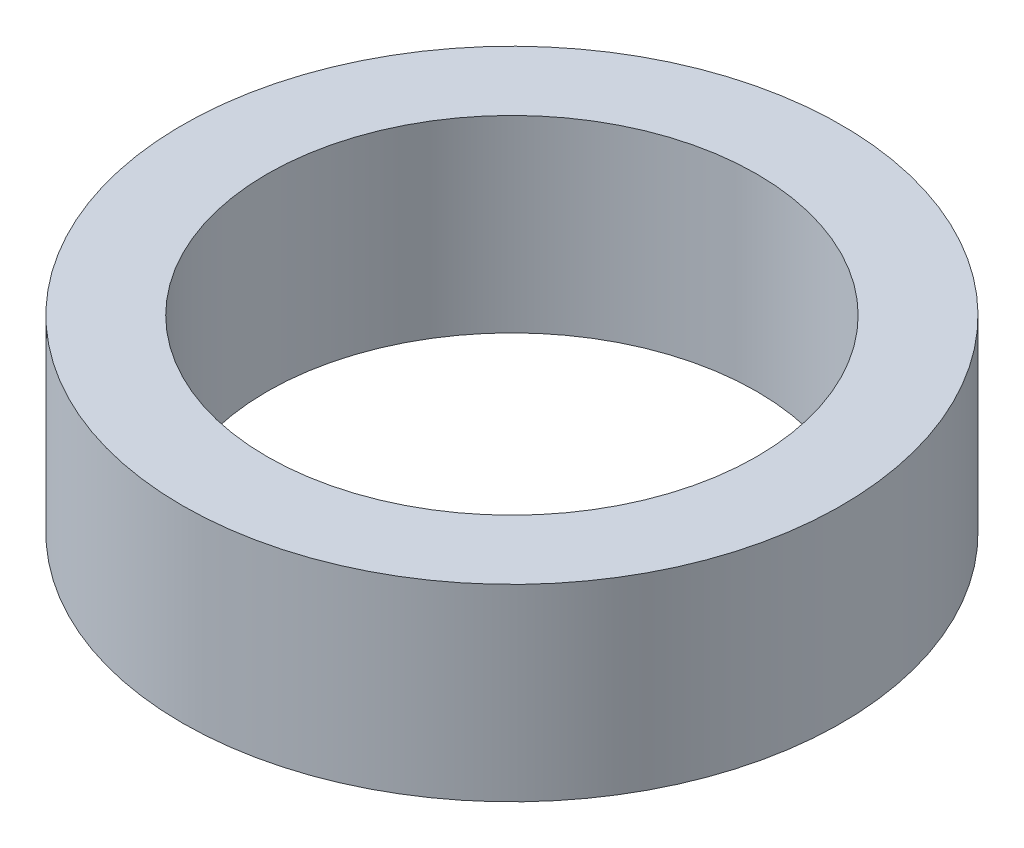
ISO-10303-21;
HEADER;
FILE_DESCRIPTION(('STEP AP214'),'2;1');
FILE_NAME('part.step','',(''),(''),'','','');
FILE_SCHEMA(('AUTOMOTIVE_DESIGN { 1 0 10303 214 1 1 1 1 }'));
ENDSEC;
DATA;
#1=APPLICATION_CONTEXT('core data for automotive mechanical design processes');
#2=APPLICATION_PROTOCOL_DEFINITION('international standard','automotive_design',2000,#1);
#3=PRODUCT_CONTEXT('',#1,'mechanical');
#4=PRODUCT('Part','Part','',(#3));
#5=PRODUCT_RELATED_PRODUCT_CATEGORY('part','',(#4));
#6=PRODUCT_DEFINITION_FORMATION('','',#4);
#7=PRODUCT_DEFINITION_CONTEXT('part definition',#1,'design');
#8=PRODUCT_DEFINITION('design','',#6,#7);
#9=PRODUCT_DEFINITION_SHAPE('','',#8);
#10=(LENGTH_UNIT() NAMED_UNIT(*) SI_UNIT(.MILLI.,.METRE.));
#11=(NAMED_UNIT(*) PLANE_ANGLE_UNIT() SI_UNIT($,.RADIAN.));
#12=(NAMED_UNIT(*) SI_UNIT($,.STERADIAN.) SOLID_ANGLE_UNIT());
#13=UNCERTAINTY_MEASURE_WITH_UNIT(LENGTH_MEASURE(1.E-05),#10,'distance_accuracy_value','');
#14=(GEOMETRIC_REPRESENTATION_CONTEXT(3) GLOBAL_UNCERTAINTY_ASSIGNED_CONTEXT((#13)) GLOBAL_UNIT_ASSIGNED_CONTEXT((#10,
#11,#12)) REPRESENTATION_CONTEXT('',''));
#15=CARTESIAN_POINT('',(0.,0.,0.));
#16=DIRECTION('',(0.,0.,1.));
#17=DIRECTION('',(1.,0.,0.));
#18=AXIS2_PLACEMENT_3D('',#15,#16,#17);
#19=CARTESIAN_POINT('',(0.,2.,0.));
#20=DIRECTION('',(0.,1.,0.));
#21=DIRECTION('',(0.,0.,1.));
#22=AXIS2_PLACEMENT_3D('',#19,#20,#21);
#23=PLANE('',#22);
#24=CARTESIAN_POINT('',(0.,2.,0.));
#25=DIRECTION('',(0.,1.,0.));
#26=DIRECTION('',(0.,0.,1.));
#27=AXIS2_PLACEMENT_3D('',#24,#25,#26);
#28=CIRCLE('',#27,3.5);
#29=CARTESIAN_POINT('',(0.,2.,3.5));
#30=VERTEX_POINT('',#29);
#31=EDGE_CURVE('E10',#30,#30,#28,.T.);
#32=ORIENTED_EDGE('',*,*,#31,.T.);
#33=EDGE_LOOP('',(#32));
#34=FACE_BOUND('',#33,.T.);
#35=CARTESIAN_POINT('',(0.,2.,0.));
#36=DIRECTION('',(0.,1.,0.));
#37=DIRECTION('',(0.,0.,1.));
#38=AXIS2_PLACEMENT_3D('',#35,#36,#37);
#39=CIRCLE('',#38,2.6);
#40=CARTESIAN_POINT('',(0.,2.,2.6));
#41=VERTEX_POINT('',#40);
#42=EDGE_CURVE('E47',#41,#41,#39,.T.);
#43=ORIENTED_EDGE('',*,*,#42,.F.);
#44=EDGE_LOOP('',(#43));
#45=FACE_BOUND('',#44,.T.);
#46=ADVANCED_FACE('F36',(#34,#45),#23,.T.);
#47=CARTESIAN_POINT('',(0.,0.,0.));
#48=DIRECTION('',(0.,1.,0.));
#49=DIRECTION('',(0.,0.,1.));
#50=AXIS2_PLACEMENT_3D('',#47,#48,#49);
#51=PLANE('',#50);
#52=CARTESIAN_POINT('',(0.,0.,0.));
#53=DIRECTION('',(0.,1.,0.));
#54=DIRECTION('',(0.,0.,1.));
#55=AXIS2_PLACEMENT_3D('',#52,#53,#54);
#56=CIRCLE('',#55,3.5);
#57=CARTESIAN_POINT('',(0.,0.,3.5));
#58=VERTEX_POINT('',#57);
#59=EDGE_CURVE('E40',#58,#58,#56,.T.);
#60=ORIENTED_EDGE('',*,*,#59,.F.);
#61=EDGE_LOOP('',(#60));
#62=FACE_BOUND('',#61,.T.);
#63=CARTESIAN_POINT('',(0.,0.,0.));
#64=DIRECTION('',(0.,1.,0.));
#65=DIRECTION('',(0.,0.,1.));
#66=AXIS2_PLACEMENT_3D('',#63,#64,#65);
#67=CIRCLE('',#66,2.6);
#68=CARTESIAN_POINT('',(0.,0.,2.6));
#69=VERTEX_POINT('',#68);
#70=EDGE_CURVE('E49',#69,#69,#67,.T.);
#71=ORIENTED_EDGE('',*,*,#70,.T.);
#72=EDGE_LOOP('',(#71));
#73=FACE_BOUND('',#72,.T.);
#74=ADVANCED_FACE('F59',(#62,#73),#51,.F.);
#75=CARTESIAN_POINT('',(0.,2.,0.));
#76=DIRECTION('',(0.,-1.,0.));
#77=DIRECTION('',(0.,0.,-1.));
#78=AXIS2_PLACEMENT_3D('',#75,#76,#77);
#79=CYLINDRICAL_SURFACE('',#78,3.5);
#80=ORIENTED_EDGE('',*,*,#31,.F.);
#81=EDGE_LOOP('',(#80));
#82=FACE_BOUND('',#81,.T.);
#83=ORIENTED_EDGE('',*,*,#59,.T.);
#84=EDGE_LOOP('',(#83));
#85=FACE_BOUND('',#84,.T.);
#86=ADVANCED_FACE('F38',(#82,#85),#79,.T.);
#87=CARTESIAN_POINT('',(0.,2.,0.));
#88=DIRECTION('',(0.,-1.,0.));
#89=DIRECTION('',(0.,0.,-1.));
#90=AXIS2_PLACEMENT_3D('',#87,#88,#89);
#91=CYLINDRICAL_SURFACE('',#90,2.6);
#92=ORIENTED_EDGE('',*,*,#42,.T.);
#93=EDGE_LOOP('',(#92));
#94=FACE_BOUND('',#93,.T.);
#95=ORIENTED_EDGE('',*,*,#70,.F.);
#96=EDGE_LOOP('',(#95));
#97=FACE_BOUND('',#96,.T.);
#98=ADVANCED_FACE('F55',(#94,#97),#91,.F.);
#99=CLOSED_SHELL('',(#46,#74,#86,#98));
#100=MANIFOLD_SOLID_BREP('B2',#99);
#101=ADVANCED_BREP_SHAPE_REPRESENTATION('',(#18,#100),#14);
#102=SHAPE_DEFINITION_REPRESENTATION(#9,#101);
ENDSEC;
END-ISO-10303-21;
